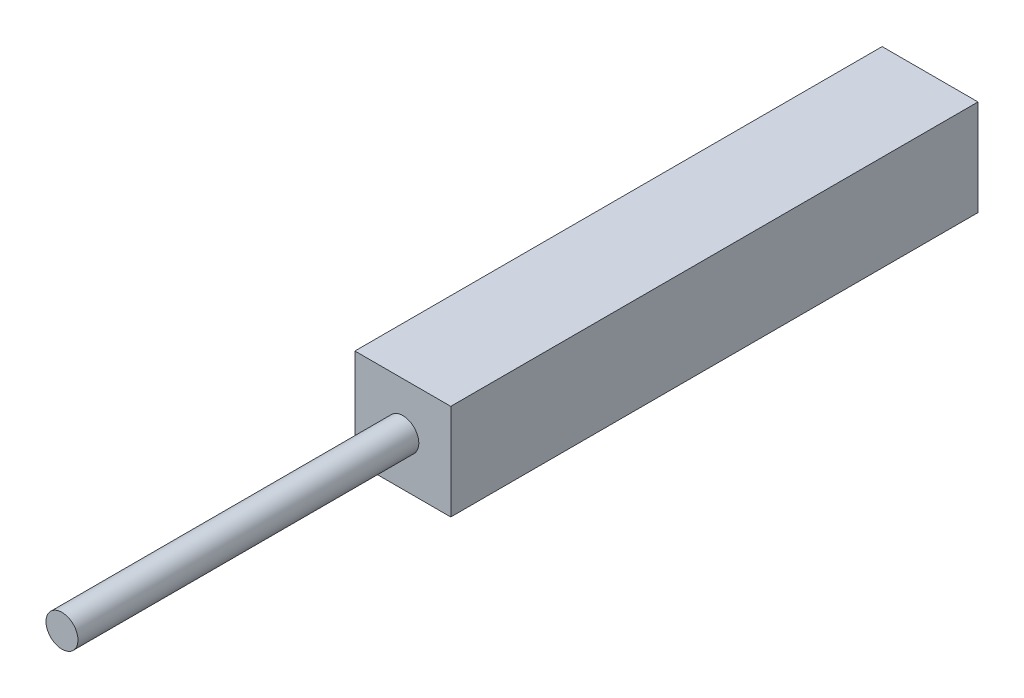
ISO-10303-21;
HEADER;
FILE_DESCRIPTION(('STEP AP214'),'2;1');
FILE_NAME('part.step','',(''),(''),'','','');
FILE_SCHEMA(('AUTOMOTIVE_DESIGN { 1 0 10303 214 1 1 1 1 }'));
ENDSEC;
DATA;
#1=APPLICATION_CONTEXT('core data for automotive mechanical design processes');
#2=APPLICATION_PROTOCOL_DEFINITION('international standard','automotive_design',2000,#1);
#3=PRODUCT_CONTEXT('',#1,'mechanical');
#4=PRODUCT('Part','Part','',(#3));
#5=PRODUCT_RELATED_PRODUCT_CATEGORY('part','',(#4));
#6=PRODUCT_DEFINITION_FORMATION('','',#4);
#7=PRODUCT_DEFINITION_CONTEXT('part definition',#1,'design');
#8=PRODUCT_DEFINITION('design','',#6,#7);
#9=PRODUCT_DEFINITION_SHAPE('','',#8);
#10=(LENGTH_UNIT() NAMED_UNIT(*) SI_UNIT(.MILLI.,.METRE.));
#11=(NAMED_UNIT(*) PLANE_ANGLE_UNIT() SI_UNIT($,.RADIAN.));
#12=(NAMED_UNIT(*) SI_UNIT($,.STERADIAN.) SOLID_ANGLE_UNIT());
#13=UNCERTAINTY_MEASURE_WITH_UNIT(LENGTH_MEASURE(1.E-05),#10,'distance_accuracy_value','');
#14=(GEOMETRIC_REPRESENTATION_CONTEXT(3) GLOBAL_UNCERTAINTY_ASSIGNED_CONTEXT((#13)) GLOBAL_UNIT_ASSIGNED_CONTEXT((#10,
#11,#12)) REPRESENTATION_CONTEXT('',''));
#15=CARTESIAN_POINT('',(0.,0.,0.));
#16=DIRECTION('',(0.,0.,1.));
#17=DIRECTION('',(1.,0.,0.));
#18=AXIS2_PLACEMENT_3D('',#15,#16,#17);
#19=CARTESIAN_POINT('',(0.,0.,99.));
#20=DIRECTION('',(0.,0.,-1.));
#21=DIRECTION('',(-1.,0.,0.));
#22=AXIS2_PLACEMENT_3D('',#19,#20,#21);
#23=PLANE('',#22);
#24=DIRECTION('',(0.,1.,0.));
#25=VECTOR('',#24,1.);
#26=CARTESIAN_POINT('',(9.,-9.,99.));
#27=LINE('',#26,#25);
#28=CARTESIAN_POINT('',(9.,-9.,99.));
#29=VERTEX_POINT('',#28);
#30=CARTESIAN_POINT('',(9.,9.,99.));
#31=VERTEX_POINT('',#30);
#32=EDGE_CURVE('E88',#29,#31,#27,.T.);
#33=ORIENTED_EDGE('',*,*,#32,.T.);
#34=DIRECTION('',(-1.,0.,0.));
#35=VECTOR('',#34,1.);
#36=CARTESIAN_POINT('',(-9.,9.,99.));
#37=LINE('',#36,#35);
#38=CARTESIAN_POINT('',(-9.,9.,99.));
#39=VERTEX_POINT('',#38);
#40=EDGE_CURVE('E83',#31,#39,#37,.T.);
#41=ORIENTED_EDGE('',*,*,#40,.T.);
#42=DIRECTION('',(0.,-1.,0.));
#43=VECTOR('',#42,1.);
#44=CARTESIAN_POINT('',(-9.,-9.,99.));
#45=LINE('',#44,#43);
#46=CARTESIAN_POINT('',(-9.,-9.,99.));
#47=VERTEX_POINT('',#46);
#48=EDGE_CURVE('E86',#39,#47,#45,.T.);
#49=ORIENTED_EDGE('',*,*,#48,.T.);
#50=DIRECTION('',(1.,0.,0.));
#51=VECTOR('',#50,1.);
#52=CARTESIAN_POINT('',(-9.,-9.,99.));
#53=LINE('',#52,#51);
#54=EDGE_CURVE('E52',#47,#29,#53,.T.);
#55=ORIENTED_EDGE('',*,*,#54,.T.);
#56=EDGE_LOOP('',(#33,#41,#49,#55));
#57=FACE_BOUND('',#56,.T.);
#58=CARTESIAN_POINT('',(0.,0.,99.));
#59=DIRECTION('',(0.,0.,-1.));
#60=DIRECTION('',(-1.,0.,0.));
#61=AXIS2_PLACEMENT_3D('',#58,#59,#60);
#62=CIRCLE('',#61,3.);
#63=CARTESIAN_POINT('',(-3.,0.,99.));
#64=VERTEX_POINT('',#63);
#65=EDGE_CURVE('E11',#64,#64,#62,.F.);
#66=ORIENTED_EDGE('',*,*,#65,.F.);
#67=EDGE_LOOP('',(#66));
#68=FACE_BOUND('',#67,.T.);
#69=ADVANCED_FACE('F35',(#57,#68),#23,.F.);
#70=CARTESIAN_POINT('',(9.,-9.,99.));
#71=DIRECTION('',(-1.,0.,0.));
#72=DIRECTION('',(0.,0.,1.));
#73=AXIS2_PLACEMENT_3D('',#70,#71,#72);
#74=PLANE('',#73);
#75=DIRECTION('',(0.,1.,0.));
#76=VECTOR('',#75,1.);
#77=CARTESIAN_POINT('',(9.,-9.,0.));
#78=LINE('',#77,#76);
#79=CARTESIAN_POINT('',(9.,-9.,0.));
#80=VERTEX_POINT('',#79);
#81=CARTESIAN_POINT('',(9.,9.,0.));
#82=VERTEX_POINT('',#81);
#83=EDGE_CURVE('E102',#80,#82,#78,.T.);
#84=ORIENTED_EDGE('',*,*,#83,.T.);
#85=DIRECTION('',(0.,0.,-1.));
#86=VECTOR('',#85,1.);
#87=CARTESIAN_POINT('',(9.,9.,99.));
#88=LINE('',#87,#86);
#89=EDGE_CURVE('E44',#31,#82,#88,.T.);
#90=ORIENTED_EDGE('',*,*,#89,.F.);
#91=ORIENTED_EDGE('',*,*,#32,.F.);
#92=DIRECTION('',(0.,0.,-1.));
#93=VECTOR('',#92,1.);
#94=CARTESIAN_POINT('',(9.,-9.,99.));
#95=LINE('',#94,#93);
#96=EDGE_CURVE('E98',#29,#80,#95,.T.);
#97=ORIENTED_EDGE('',*,*,#96,.T.);
#98=EDGE_LOOP('',(#84,#90,#91,#97));
#99=FACE_BOUND('',#98,.T.);
#100=ADVANCED_FACE('F37',(#99),#74,.F.);
#101=CARTESIAN_POINT('',(-9.,9.,99.));
#102=DIRECTION('',(0.,-1.,0.));
#103=DIRECTION('',(0.,0.,-1.));
#104=AXIS2_PLACEMENT_3D('',#101,#102,#103);
#105=PLANE('',#104);
#106=DIRECTION('',(-1.,0.,0.));
#107=VECTOR('',#106,1.);
#108=CARTESIAN_POINT('',(-9.,9.,0.));
#109=LINE('',#108,#107);
#110=CARTESIAN_POINT('',(-9.,9.,0.));
#111=VERTEX_POINT('',#110);
#112=EDGE_CURVE('E93',#82,#111,#109,.T.);
#113=ORIENTED_EDGE('',*,*,#112,.T.);
#114=DIRECTION('',(0.,0.,-1.));
#115=VECTOR('',#114,1.);
#116=CARTESIAN_POINT('',(-9.,9.,99.));
#117=LINE('',#116,#115);
#118=EDGE_CURVE('E91',#39,#111,#117,.T.);
#119=ORIENTED_EDGE('',*,*,#118,.F.);
#120=ORIENTED_EDGE('',*,*,#40,.F.);
#121=ORIENTED_EDGE('',*,*,#89,.T.);
#122=EDGE_LOOP('',(#113,#119,#120,#121));
#123=FACE_BOUND('',#122,.T.);
#124=ADVANCED_FACE('F92',(#123),#105,.F.);
#125=CARTESIAN_POINT('',(-9.,-9.,99.));
#126=DIRECTION('',(1.,0.,0.));
#127=DIRECTION('',(0.,0.,-1.));
#128=AXIS2_PLACEMENT_3D('',#125,#126,#127);
#129=PLANE('',#128);
#130=DIRECTION('',(0.,-1.,0.));
#131=VECTOR('',#130,1.);
#132=CARTESIAN_POINT('',(-9.,-9.,0.));
#133=LINE('',#132,#131);
#134=CARTESIAN_POINT('',(-9.,-9.,0.));
#135=VERTEX_POINT('',#134);
#136=EDGE_CURVE('E69',#111,#135,#133,.T.);
#137=ORIENTED_EDGE('',*,*,#136,.T.);
#138=DIRECTION('',(0.,0.,-1.));
#139=VECTOR('',#138,1.);
#140=CARTESIAN_POINT('',(-9.,-9.,99.));
#141=LINE('',#140,#139);
#142=EDGE_CURVE('E94',#47,#135,#141,.T.);
#143=ORIENTED_EDGE('',*,*,#142,.F.);
#144=ORIENTED_EDGE('',*,*,#48,.F.);
#145=ORIENTED_EDGE('',*,*,#118,.T.);
#146=EDGE_LOOP('',(#137,#143,#144,#145));
#147=FACE_BOUND('',#146,.T.);
#148=ADVANCED_FACE('F96',(#147),#129,.F.);
#149=CARTESIAN_POINT('',(-9.,-9.,99.));
#150=DIRECTION('',(0.,1.,0.));
#151=DIRECTION('',(0.,0.,1.));
#152=AXIS2_PLACEMENT_3D('',#149,#150,#151);
#153=PLANE('',#152);
#154=DIRECTION('',(1.,0.,0.));
#155=VECTOR('',#154,1.);
#156=CARTESIAN_POINT('',(-9.,-9.,0.));
#157=LINE('',#156,#155);
#158=EDGE_CURVE('E75',#135,#80,#157,.T.);
#159=ORIENTED_EDGE('',*,*,#158,.T.);
#160=ORIENTED_EDGE('',*,*,#96,.F.);
#161=ORIENTED_EDGE('',*,*,#54,.F.);
#162=ORIENTED_EDGE('',*,*,#142,.T.);
#163=EDGE_LOOP('',(#159,#160,#161,#162));
#164=FACE_BOUND('',#163,.T.);
#165=ADVANCED_FACE('F116',(#164),#153,.F.);
#166=CARTESIAN_POINT('',(0.,0.,0.));
#167=DIRECTION('',(0.,0.,-1.));
#168=DIRECTION('',(-1.,0.,0.));
#169=AXIS2_PLACEMENT_3D('',#166,#167,#168);
#170=PLANE('',#169);
#171=ORIENTED_EDGE('',*,*,#83,.F.);
#172=ORIENTED_EDGE('',*,*,#158,.F.);
#173=ORIENTED_EDGE('',*,*,#136,.F.);
#174=ORIENTED_EDGE('',*,*,#112,.F.);
#175=EDGE_LOOP('',(#171,#172,#173,#174));
#176=FACE_BOUND('',#175,.T.);
#177=ADVANCED_FACE('F113',(#176),#170,.T.);
#178=CARTESIAN_POINT('',(0.,0.,163.));
#179=DIRECTION('',(0.,0.,-1.));
#180=DIRECTION('',(-1.,0.,0.));
#181=AXIS2_PLACEMENT_3D('',#178,#179,#180);
#182=CYLINDRICAL_SURFACE('',#181,3.);
#183=CARTESIAN_POINT('',(0.,0.,163.));
#184=DIRECTION('',(0.,0.,1.));
#185=DIRECTION('',(1.,0.,0.));
#186=AXIS2_PLACEMENT_3D('',#183,#184,#185);
#187=CIRCLE('',#186,3.);
#188=CARTESIAN_POINT('',(3.,0.,163.));
#189=VERTEX_POINT('',#188);
#190=EDGE_CURVE('E105',#189,#189,#187,.T.);
#191=ORIENTED_EDGE('',*,*,#190,.F.);
#192=EDGE_LOOP('',(#191));
#193=FACE_BOUND('',#192,.T.);
#194=ORIENTED_EDGE('',*,*,#65,.T.);
#195=EDGE_LOOP('',(#194));
#196=FACE_BOUND('',#195,.T.);
#197=ADVANCED_FACE('F115',(#193,#196),#182,.T.);
#198=CARTESIAN_POINT('',(0.,0.,163.));
#199=DIRECTION('',(0.,0.,1.));
#200=DIRECTION('',(1.,0.,0.));
#201=AXIS2_PLACEMENT_3D('',#198,#199,#200);
#202=PLANE('',#201);
#203=ORIENTED_EDGE('',*,*,#190,.T.);
#204=EDGE_LOOP('',(#203));
#205=FACE_BOUND('',#204,.T.);
#206=ADVANCED_FACE('F122',(#205),#202,.T.);
#207=CLOSED_SHELL('',(#69,#100,#124,#148,#165,#177,#197,#206));
#208=MANIFOLD_SOLID_BREP('B2',#207);
#209=ADVANCED_BREP_SHAPE_REPRESENTATION('',(#18,#208),#14);
#210=SHAPE_DEFINITION_REPRESENTATION(#9,#209);
ENDSEC;
END-ISO-10303-21;
